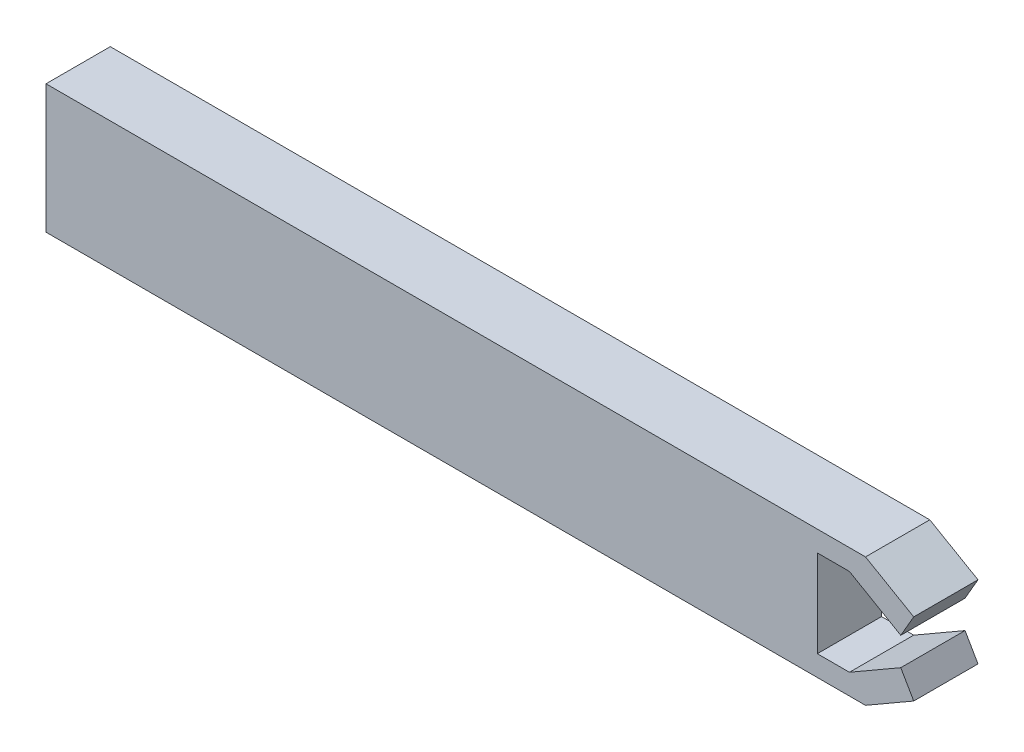
ISO-10303-21;
HEADER;
FILE_DESCRIPTION(('STEP AP214'),'2;1');
FILE_NAME('part.step','',(''),(''),'','','');
FILE_SCHEMA(('AUTOMOTIVE_DESIGN { 1 0 10303 214 1 1 1 1 }'));
ENDSEC;
DATA;
#1=APPLICATION_CONTEXT('core data for automotive mechanical design processes');
#2=APPLICATION_PROTOCOL_DEFINITION('international standard','automotive_design',2000,#1);
#3=PRODUCT_CONTEXT('',#1,'mechanical');
#4=PRODUCT('Part','Part','',(#3));
#5=PRODUCT_RELATED_PRODUCT_CATEGORY('part','',(#4));
#6=PRODUCT_DEFINITION_FORMATION('','',#4);
#7=PRODUCT_DEFINITION_CONTEXT('part definition',#1,'design');
#8=PRODUCT_DEFINITION('design','',#6,#7);
#9=PRODUCT_DEFINITION_SHAPE('','',#8);
#10=(LENGTH_UNIT() NAMED_UNIT(*) SI_UNIT(.MILLI.,.METRE.));
#11=(NAMED_UNIT(*) PLANE_ANGLE_UNIT() SI_UNIT($,.RADIAN.));
#12=(NAMED_UNIT(*) SI_UNIT($,.STERADIAN.) SOLID_ANGLE_UNIT());
#13=UNCERTAINTY_MEASURE_WITH_UNIT(LENGTH_MEASURE(1.E-05),#10,'distance_accuracy_value','');
#14=(GEOMETRIC_REPRESENTATION_CONTEXT(3) GLOBAL_UNCERTAINTY_ASSIGNED_CONTEXT((#13)) GLOBAL_UNIT_ASSIGNED_CONTEXT((#10,
#11,#12)) REPRESENTATION_CONTEXT('',''));
#15=CARTESIAN_POINT('',(0.,0.,0.));
#16=DIRECTION('',(0.,0.,1.));
#17=DIRECTION('',(1.,0.,0.));
#18=AXIS2_PLACEMENT_3D('',#15,#16,#17);
#19=CARTESIAN_POINT('',(-30.0000000000001,0.,20.));
#20=DIRECTION('',(1.,0.,0.));
#21=DIRECTION('',(0.,1.,0.));
#22=AXIS2_PLACEMENT_3D('',#19,#20,#21);
#23=PLANE('',#22);
#24=DIRECTION('',(0.,-1.,0.));
#25=VECTOR('',#24,1.);
#26=CARTESIAN_POINT('',(-30.0000000000001,0.,0.));
#27=LINE('',#26,#25);
#28=CARTESIAN_POINT('',(-30.0000000000001,33.5825556046246,0.));
#29=VERTEX_POINT('',#28);
#30=CARTESIAN_POINT('',(-30.0000000000001,6.4174443953755,0.));
#31=VERTEX_POINT('',#30);
#32=EDGE_CURVE('E157',#29,#31,#27,.T.);
#33=ORIENTED_EDGE('',*,*,#32,.F.);
#34=DIRECTION('',(0.,0.,-1.));
#35=VECTOR('',#34,1.);
#36=CARTESIAN_POINT('',(-30.0000000000001,33.5825556046246,20.));
#37=LINE('',#36,#35);
#38=CARTESIAN_POINT('',(-30.0000000000001,33.5825556046246,20.));
#39=VERTEX_POINT('',#38);
#40=EDGE_CURVE('E11',#39,#29,#37,.T.);
#41=ORIENTED_EDGE('',*,*,#40,.F.);
#42=DIRECTION('',(0.,-1.,0.));
#43=VECTOR('',#42,1.);
#44=CARTESIAN_POINT('',(-30.0000000000001,0.,20.));
#45=LINE('',#44,#43);
#46=CARTESIAN_POINT('',(-30.0000000000001,6.4174443953755,20.));
#47=VERTEX_POINT('',#46);
#48=EDGE_CURVE('E188',#39,#47,#45,.T.);
#49=ORIENTED_EDGE('',*,*,#48,.T.);
#50=DIRECTION('',(0.,0.,-1.));
#51=VECTOR('',#50,1.);
#52=CARTESIAN_POINT('',(-30.0000000000001,6.4174443953755,20.));
#53=LINE('',#52,#51);
#54=EDGE_CURVE('E101',#47,#31,#53,.T.);
#55=ORIENTED_EDGE('',*,*,#54,.T.);
#56=EDGE_LOOP('',(#33,#41,#49,#55));
#57=FACE_BOUND('',#56,.T.);
#58=ADVANCED_FACE('F39',(#57),#23,.T.);
#59=CARTESIAN_POINT('',(0.,33.5825556046246,20.));
#60=DIRECTION('',(0.,-1.,0.));
#61=DIRECTION('',(0.,0.,-1.));
#62=AXIS2_PLACEMENT_3D('',#59,#60,#61);
#63=PLANE('',#62);
#64=DIRECTION('',(-1.,0.,0.));
#65=VECTOR('',#64,1.);
#66=CARTESIAN_POINT('',(0.,33.5825556046246,0.));
#67=LINE('',#66,#65);
#68=CARTESIAN_POINT('',(-20.0000000000002,33.5825556046246,0.));
#69=VERTEX_POINT('',#68);
#70=EDGE_CURVE('E160',#69,#29,#67,.T.);
#71=ORIENTED_EDGE('',*,*,#70,.F.);
#72=DIRECTION('',(0.,0.,-1.));
#73=VECTOR('',#72,1.);
#74=CARTESIAN_POINT('',(-20.0000000000002,33.5825556046246,20.));
#75=LINE('',#74,#73);
#76=CARTESIAN_POINT('',(-20.0000000000002,33.5825556046246,20.));
#77=VERTEX_POINT('',#76);
#78=EDGE_CURVE('E47',#77,#69,#75,.T.);
#79=ORIENTED_EDGE('',*,*,#78,.F.);
#80=DIRECTION('',(-1.,0.,0.));
#81=VECTOR('',#80,1.);
#82=CARTESIAN_POINT('',(0.,33.5825556046246,20.));
#83=LINE('',#82,#81);
#84=EDGE_CURVE('E217',#77,#39,#83,.T.);
#85=ORIENTED_EDGE('',*,*,#84,.T.);
#86=ORIENTED_EDGE('',*,*,#40,.T.);
#87=EDGE_LOOP('',(#71,#79,#85,#86));
#88=FACE_BOUND('',#87,.T.);
#89=ADVANCED_FACE('F216',(#88),#63,.T.);
#90=CARTESIAN_POINT('',(9.54167313880412,16.5266626656242,20.));
#91=DIRECTION('',(0.499999999999994,0.866025403784442,0.));
#92=DIRECTION('',(-0.866025403784442,0.499999999999994,0.));
#93=AXIS2_PLACEMENT_3D('',#90,#91,#92);
#94=PLANE('',#93);
#95=DIRECTION('',(0.866025403784442,-0.499999999999994,0.));
#96=VECTOR('',#95,1.);
#97=CARTESIAN_POINT('',(9.54167313880412,16.5266626656242,0.));
#98=LINE('',#97,#96);
#99=CARTESIAN_POINT('',(-4.02883493688466,24.361599156163,0.));
#100=VERTEX_POINT('',#99);
#101=EDGE_CURVE('E163',#69,#100,#98,.T.);
#102=ORIENTED_EDGE('',*,*,#101,.T.);
#103=DIRECTION('',(0.,0.,-1.));
#104=VECTOR('',#103,1.);
#105=CARTESIAN_POINT('',(-4.02883493688466,24.361599156163,20.));
#106=LINE('',#105,#104);
#107=CARTESIAN_POINT('',(-4.02883493688466,24.361599156163,20.));
#108=VERTEX_POINT('',#107);
#109=EDGE_CURVE('E202',#108,#100,#106,.T.);
#110=ORIENTED_EDGE('',*,*,#109,.F.);
#111=DIRECTION('',(0.866025403784442,-0.499999999999994,0.));
#112=VECTOR('',#111,1.);
#113=CARTESIAN_POINT('',(9.54167313880412,16.5266626656242,20.));
#114=LINE('',#113,#112);
#115=EDGE_CURVE('E208',#77,#108,#114,.T.);
#116=ORIENTED_EDGE('',*,*,#115,.F.);
#117=ORIENTED_EDGE('',*,*,#78,.T.);
#118=EDGE_LOOP('',(#102,#110,#116,#117));
#119=FACE_BOUND('',#118,.T.);
#120=ADVANCED_FACE('F206',(#119),#94,.F.);
#121=CARTESIAN_POINT('',(-13.5705080756888,7.83493649053896,20.));
#122=DIRECTION('',(0.866025403784438,-0.500000000000001,0.));
#123=DIRECTION('',(0.500000000000001,0.866025403784438,0.));
#124=AXIS2_PLACEMENT_3D('',#121,#122,#123);
#125=PLANE('',#124);
#126=DIRECTION('',(-0.500000000000001,-0.866025403784438,0.));
#127=VECTOR('',#126,1.);
#128=CARTESIAN_POINT('',(-13.5705080756888,7.83493649053896,0.));
#129=LINE('',#128,#127);
#130=CARTESIAN_POINT('',(0.,31.3397459621557,0.));
#131=VERTEX_POINT('',#130);
#132=EDGE_CURVE('E166',#131,#100,#129,.T.);
#133=ORIENTED_EDGE('',*,*,#132,.F.);
#134=DIRECTION('',(0.,0.,-1.));
#135=VECTOR('',#134,1.);
#136=CARTESIAN_POINT('',(0.,31.3397459621557,20.));
#137=LINE('',#136,#135);
#138=CARTESIAN_POINT('',(0.,31.3397459621557,20.));
#139=VERTEX_POINT('',#138);
#140=EDGE_CURVE('E200',#139,#131,#137,.T.);
#141=ORIENTED_EDGE('',*,*,#140,.F.);
#142=DIRECTION('',(-0.500000000000001,-0.866025403784438,0.));
#143=VECTOR('',#142,1.);
#144=CARTESIAN_POINT('',(-13.5705080756888,7.83493649053896,20.));
#145=LINE('',#144,#143);
#146=EDGE_CURVE('E223',#139,#108,#145,.T.);
#147=ORIENTED_EDGE('',*,*,#146,.T.);
#148=ORIENTED_EDGE('',*,*,#109,.T.);
#149=EDGE_LOOP('',(#133,#141,#147,#148));
#150=FACE_BOUND('',#149,.T.);
#151=ADVANCED_FACE('F265',(#150),#125,.T.);
#152=CARTESIAN_POINT('',(13.5705080756887,23.504809471617,20.));
#153=DIRECTION('',(0.499999999999992,0.866025403784443,0.));
#154=DIRECTION('',(-0.866025403784443,0.499999999999992,0.));
#155=AXIS2_PLACEMENT_3D('',#152,#153,#154);
#156=PLANE('',#155);
#157=DIRECTION('',(0.866025403784443,-0.499999999999992,0.));
#158=VECTOR('',#157,1.);
#159=CARTESIAN_POINT('',(13.5705080756887,23.504809471617,0.));
#160=LINE('',#159,#158);
#161=CARTESIAN_POINT('',(-15.,40.,0.));
#162=VERTEX_POINT('',#161);
#163=EDGE_CURVE('E169',#162,#131,#160,.T.);
#164=ORIENTED_EDGE('',*,*,#163,.F.);
#165=DIRECTION('',(0.,0.,-1.));
#166=VECTOR('',#165,1.);
#167=CARTESIAN_POINT('',(-15.,40.,20.));
#168=LINE('',#167,#166);
#169=CARTESIAN_POINT('',(-15.,40.,20.));
#170=VERTEX_POINT('',#169);
#171=EDGE_CURVE('E198',#170,#162,#168,.T.);
#172=ORIENTED_EDGE('',*,*,#171,.F.);
#173=DIRECTION('',(0.866025403784443,-0.499999999999992,0.));
#174=VECTOR('',#173,1.);
#175=CARTESIAN_POINT('',(13.5705080756887,23.504809471617,20.));
#176=LINE('',#175,#174);
#177=EDGE_CURVE('E226',#170,#139,#176,.T.);
#178=ORIENTED_EDGE('',*,*,#177,.T.);
#179=ORIENTED_EDGE('',*,*,#140,.T.);
#180=EDGE_LOOP('',(#164,#172,#178,#179));
#181=FACE_BOUND('',#180,.T.);
#182=ADVANCED_FACE('F270',(#181),#156,.T.);
#183=CARTESIAN_POINT('',(0.,40.,20.));
#184=DIRECTION('',(0.,-1.,0.));
#185=DIRECTION('',(1.,0.,0.));
#186=AXIS2_PLACEMENT_3D('',#183,#184,#185);
#187=PLANE('',#186);
#188=DIRECTION('',(-1.,0.,0.));
#189=VECTOR('',#188,1.);
#190=CARTESIAN_POINT('',(0.,40.,0.));
#191=LINE('',#190,#189);
#192=CARTESIAN_POINT('',(-270.,40.,0.));
#193=VERTEX_POINT('',#192);
#194=EDGE_CURVE('E172',#162,#193,#191,.T.);
#195=ORIENTED_EDGE('',*,*,#194,.T.);
#196=DIRECTION('',(0.,0.,-1.));
#197=VECTOR('',#196,1.);
#198=CARTESIAN_POINT('',(-270.,40.,20.));
#199=LINE('',#198,#197);
#200=CARTESIAN_POINT('',(-270.,40.,20.));
#201=VERTEX_POINT('',#200);
#202=EDGE_CURVE('E196',#201,#193,#199,.T.);
#203=ORIENTED_EDGE('',*,*,#202,.F.);
#204=DIRECTION('',(-1.,0.,0.));
#205=VECTOR('',#204,1.);
#206=CARTESIAN_POINT('',(0.,40.,20.));
#207=LINE('',#206,#205);
#208=EDGE_CURVE('E229',#170,#201,#207,.T.);
#209=ORIENTED_EDGE('',*,*,#208,.F.);
#210=ORIENTED_EDGE('',*,*,#171,.T.);
#211=EDGE_LOOP('',(#195,#203,#209,#210));
#212=FACE_BOUND('',#211,.T.);
#213=ADVANCED_FACE('F274',(#212),#187,.F.);
#214=CARTESIAN_POINT('',(-270.,0.,20.));
#215=DIRECTION('',(-1.,0.,0.));
#216=DIRECTION('',(0.,0.,1.));
#217=AXIS2_PLACEMENT_3D('',#214,#215,#216);
#218=PLANE('',#217);
#219=DIRECTION('',(0.,1.,0.));
#220=VECTOR('',#219,1.);
#221=CARTESIAN_POINT('',(-270.,0.,0.));
#222=LINE('',#221,#220);
#223=CARTESIAN_POINT('',(-270.,0.,0.));
#224=VERTEX_POINT('',#223);
#225=EDGE_CURVE('E175',#224,#193,#222,.T.);
#226=ORIENTED_EDGE('',*,*,#225,.F.);
#227=DIRECTION('',(0.,0.,-1.));
#228=VECTOR('',#227,1.);
#229=CARTESIAN_POINT('',(-270.,0.,20.));
#230=LINE('',#229,#228);
#231=CARTESIAN_POINT('',(-270.,0.,20.));
#232=VERTEX_POINT('',#231);
#233=EDGE_CURVE('E194',#232,#224,#230,.T.);
#234=ORIENTED_EDGE('',*,*,#233,.F.);
#235=DIRECTION('',(0.,1.,0.));
#236=VECTOR('',#235,1.);
#237=CARTESIAN_POINT('',(-270.,0.,20.));
#238=LINE('',#237,#236);
#239=EDGE_CURVE('E231',#232,#201,#238,.T.);
#240=ORIENTED_EDGE('',*,*,#239,.T.);
#241=ORIENTED_EDGE('',*,*,#202,.T.);
#242=EDGE_LOOP('',(#226,#234,#240,#241));
#243=FACE_BOUND('',#242,.T.);
#244=ADVANCED_FACE('F245',(#243),#218,.T.);
#245=CARTESIAN_POINT('',(0.,0.,20.));
#246=DIRECTION('',(0.,-1.,0.));
#247=DIRECTION('',(0.,0.,-1.));
#248=AXIS2_PLACEMENT_3D('',#245,#246,#247);
#249=PLANE('',#248);
#250=DIRECTION('',(-1.,0.,0.));
#251=VECTOR('',#250,1.);
#252=CARTESIAN_POINT('',(0.,0.,0.));
#253=LINE('',#252,#251);
#254=CARTESIAN_POINT('',(-15.,0.,0.));
#255=VERTEX_POINT('',#254);
#256=EDGE_CURVE('E178',#255,#224,#253,.T.);
#257=ORIENTED_EDGE('',*,*,#256,.F.);
#258=DIRECTION('',(0.,0.,-1.));
#259=VECTOR('',#258,1.);
#260=CARTESIAN_POINT('',(-15.,0.,20.));
#261=LINE('',#260,#259);
#262=CARTESIAN_POINT('',(-15.,0.,20.));
#263=VERTEX_POINT('',#262);
#264=EDGE_CURVE('E192',#263,#255,#261,.T.);
#265=ORIENTED_EDGE('',*,*,#264,.F.);
#266=DIRECTION('',(-1.,0.,0.));
#267=VECTOR('',#266,1.);
#268=CARTESIAN_POINT('',(0.,0.,20.));
#269=LINE('',#268,#267);
#270=EDGE_CURVE('E234',#263,#232,#269,.T.);
#271=ORIENTED_EDGE('',*,*,#270,.T.);
#272=ORIENTED_EDGE('',*,*,#233,.T.);
#273=EDGE_LOOP('',(#257,#265,#271,#272));
#274=FACE_BOUND('',#273,.T.);
#275=ADVANCED_FACE('F238',(#274),#249,.T.);
#276=CARTESIAN_POINT('',(-3.74999999999992,6.49519052838324,20.));
#277=DIRECTION('',(-0.499999999999995,0.866025403784442,0.));
#278=DIRECTION('',(-0.866025403784442,-0.499999999999995,0.));
#279=AXIS2_PLACEMENT_3D('',#276,#277,#278);
#280=PLANE('',#279);
#281=DIRECTION('',(0.866025403784442,0.499999999999995,0.));
#282=VECTOR('',#281,1.);
#283=CARTESIAN_POINT('',(-3.74999999999992,6.49519052838324,0.));
#284=LINE('',#283,#282);
#285=CARTESIAN_POINT('',(0.,8.66025403784426,0.));
#286=VERTEX_POINT('',#285);
#287=EDGE_CURVE('E181',#255,#286,#284,.T.);
#288=ORIENTED_EDGE('',*,*,#287,.T.);
#289=DIRECTION('',(0.,0.,-1.));
#290=VECTOR('',#289,1.);
#291=CARTESIAN_POINT('',(0.,8.66025403784426,20.));
#292=LINE('',#291,#290);
#293=CARTESIAN_POINT('',(0.,8.66025403784426,20.));
#294=VERTEX_POINT('',#293);
#295=EDGE_CURVE('E150',#294,#286,#292,.T.);
#296=ORIENTED_EDGE('',*,*,#295,.F.);
#297=DIRECTION('',(0.866025403784442,0.499999999999995,0.));
#298=VECTOR('',#297,1.);
#299=CARTESIAN_POINT('',(-3.74999999999992,6.49519052838324,20.));
#300=LINE('',#299,#298);
#301=EDGE_CURVE('E137',#263,#294,#300,.T.);
#302=ORIENTED_EDGE('',*,*,#301,.F.);
#303=ORIENTED_EDGE('',*,*,#264,.T.);
#304=EDGE_LOOP('',(#288,#296,#302,#303));
#305=FACE_BOUND('',#304,.T.);
#306=ADVANCED_FACE('F249',(#305),#280,.F.);
#307=CARTESIAN_POINT('',(3.74999999999994,2.16506350946106,20.));
#308=DIRECTION('',(-0.866025403784439,-0.5,0.));
#309=DIRECTION('',(0.5,-0.866025403784439,0.));
#310=AXIS2_PLACEMENT_3D('',#307,#308,#309);
#311=PLANE('',#310);
#312=DIRECTION('',(-0.5,0.866025403784439,0.));
#313=VECTOR('',#312,1.);
#314=CARTESIAN_POINT('',(3.74999999999994,2.16506350946106,0.));
#315=LINE('',#314,#313);
#316=CARTESIAN_POINT('',(-4.02883493688472,15.6384008438371,0.));
#317=VERTEX_POINT('',#316);
#318=EDGE_CURVE('E146',#286,#317,#315,.T.);
#319=ORIENTED_EDGE('',*,*,#318,.T.);
#320=DIRECTION('',(0.,0.,-1.));
#321=VECTOR('',#320,1.);
#322=CARTESIAN_POINT('',(-4.02883493688472,15.6384008438371,20.));
#323=LINE('',#322,#321);
#324=CARTESIAN_POINT('',(-4.02883493688472,15.6384008438371,20.));
#325=VERTEX_POINT('',#324);
#326=EDGE_CURVE('E143',#325,#317,#323,.T.);
#327=ORIENTED_EDGE('',*,*,#326,.F.);
#328=DIRECTION('',(-0.5,0.866025403784439,0.));
#329=VECTOR('',#328,1.);
#330=CARTESIAN_POINT('',(3.74999999999994,2.16506350946106,20.));
#331=LINE('',#330,#329);
#332=EDGE_CURVE('E130',#294,#325,#331,.T.);
#333=ORIENTED_EDGE('',*,*,#332,.F.);
#334=ORIENTED_EDGE('',*,*,#295,.T.);
#335=EDGE_LOOP('',(#319,#327,#333,#334));
#336=FACE_BOUND('',#335,.T.);
#337=ADVANCED_FACE('F144',(#336),#311,.F.);
#338=CARTESIAN_POINT('',(-7.77883493688467,13.4733373343761,20.));
#339=DIRECTION('',(-0.5,0.866025403784438,0.));
#340=DIRECTION('',(-0.866025403784438,-0.5,0.));
#341=AXIS2_PLACEMENT_3D('',#338,#339,#340);
#342=PLANE('',#341);
#343=DIRECTION('',(0.866025403784438,0.5,0.));
#344=VECTOR('',#343,1.);
#345=CARTESIAN_POINT('',(-7.77883493688467,13.4733373343761,0.));
#346=LINE('',#345,#344);
#347=CARTESIAN_POINT('',(-20.0000000000001,6.4174443953755,0.));
#348=VERTEX_POINT('',#347);
#349=EDGE_CURVE('E184',#348,#317,#346,.T.);
#350=ORIENTED_EDGE('',*,*,#349,.F.);
#351=DIRECTION('',(0.,0.,-1.));
#352=VECTOR('',#351,1.);
#353=CARTESIAN_POINT('',(-20.0000000000001,6.4174443953755,20.));
#354=LINE('',#353,#352);
#355=CARTESIAN_POINT('',(-20.0000000000001,6.4174443953755,20.));
#356=VERTEX_POINT('',#355);
#357=EDGE_CURVE('E94',#356,#348,#354,.T.);
#358=ORIENTED_EDGE('',*,*,#357,.F.);
#359=DIRECTION('',(0.866025403784438,0.5,0.));
#360=VECTOR('',#359,1.);
#361=CARTESIAN_POINT('',(-7.77883493688467,13.4733373343761,20.));
#362=LINE('',#361,#360);
#363=EDGE_CURVE('E134',#356,#325,#362,.T.);
#364=ORIENTED_EDGE('',*,*,#363,.T.);
#365=ORIENTED_EDGE('',*,*,#326,.T.);
#366=EDGE_LOOP('',(#350,#358,#364,#365));
#367=FACE_BOUND('',#366,.T.);
#368=ADVANCED_FACE('F152',(#367),#342,.T.);
#369=CARTESIAN_POINT('',(0.,6.41744439537551,20.));
#370=DIRECTION('',(0.,-1.,0.));
#371=DIRECTION('',(1.,0.,0.));
#372=AXIS2_PLACEMENT_3D('',#369,#370,#371);
#373=PLANE('',#372);
#374=DIRECTION('',(-1.,0.,0.));
#375=VECTOR('',#374,1.);
#376=CARTESIAN_POINT('',(0.,6.41744439537551,0.));
#377=LINE('',#376,#375);
#378=EDGE_CURVE('E186',#348,#31,#377,.T.);
#379=ORIENTED_EDGE('',*,*,#378,.T.);
#380=ORIENTED_EDGE('',*,*,#54,.F.);
#381=DIRECTION('',(-1.,0.,0.));
#382=VECTOR('',#381,1.);
#383=CARTESIAN_POINT('',(0.,6.41744439537551,20.));
#384=LINE('',#383,#382);
#385=EDGE_CURVE('E55',#356,#47,#384,.T.);
#386=ORIENTED_EDGE('',*,*,#385,.F.);
#387=ORIENTED_EDGE('',*,*,#357,.T.);
#388=EDGE_LOOP('',(#379,#380,#386,#387));
#389=FACE_BOUND('',#388,.T.);
#390=ADVANCED_FACE('F218',(#389),#373,.F.);
#391=CARTESIAN_POINT('',(0.,0.,20.));
#392=DIRECTION('',(0.,0.,1.));
#393=DIRECTION('',(1.,0.,0.));
#394=AXIS2_PLACEMENT_3D('',#391,#392,#393);
#395=PLANE('',#394);
#396=ORIENTED_EDGE('',*,*,#48,.F.);
#397=ORIENTED_EDGE('',*,*,#84,.F.);
#398=ORIENTED_EDGE('',*,*,#115,.T.);
#399=ORIENTED_EDGE('',*,*,#146,.F.);
#400=ORIENTED_EDGE('',*,*,#177,.F.);
#401=ORIENTED_EDGE('',*,*,#208,.T.);
#402=ORIENTED_EDGE('',*,*,#239,.F.);
#403=ORIENTED_EDGE('',*,*,#270,.F.);
#404=ORIENTED_EDGE('',*,*,#301,.T.);
#405=ORIENTED_EDGE('',*,*,#332,.T.);
#406=ORIENTED_EDGE('',*,*,#363,.F.);
#407=ORIENTED_EDGE('',*,*,#385,.T.);
#408=EDGE_LOOP('',(#396,#397,#398,#399,#400,#401,#402,#403,#404,#405,#406,#407));
#409=FACE_BOUND('',#408,.T.);
#410=ADVANCED_FACE('F132',(#409),#395,.T.);
#411=CARTESIAN_POINT('',(0.,0.,0.));
#412=DIRECTION('',(0.,0.,1.));
#413=DIRECTION('',(1.,0.,0.));
#414=AXIS2_PLACEMENT_3D('',#411,#412,#413);
#415=PLANE('',#414);
#416=ORIENTED_EDGE('',*,*,#32,.T.);
#417=ORIENTED_EDGE('',*,*,#378,.F.);
#418=ORIENTED_EDGE('',*,*,#349,.T.);
#419=ORIENTED_EDGE('',*,*,#318,.F.);
#420=ORIENTED_EDGE('',*,*,#287,.F.);
#421=ORIENTED_EDGE('',*,*,#256,.T.);
#422=ORIENTED_EDGE('',*,*,#225,.T.);
#423=ORIENTED_EDGE('',*,*,#194,.F.);
#424=ORIENTED_EDGE('',*,*,#163,.T.);
#425=ORIENTED_EDGE('',*,*,#132,.T.);
#426=ORIENTED_EDGE('',*,*,#101,.F.);
#427=ORIENTED_EDGE('',*,*,#70,.T.);
#428=EDGE_LOOP('',(#416,#417,#418,#419,#420,#421,#422,#423,#424,#425,#426,#427));
#429=FACE_BOUND('',#428,.T.);
#430=ADVANCED_FACE('F214',(#429),#415,.F.);
#431=CLOSED_SHELL('',(#58,#89,#120,#151,#182,#213,#244,#275,#306,#337,#368,#390,#410,#430));
#432=MANIFOLD_SOLID_BREP('B2',#431);
#433=ADVANCED_BREP_SHAPE_REPRESENTATION('',(#18,#432),#14);
#434=SHAPE_DEFINITION_REPRESENTATION(#9,#433);
ENDSEC;
END-ISO-10303-21;
